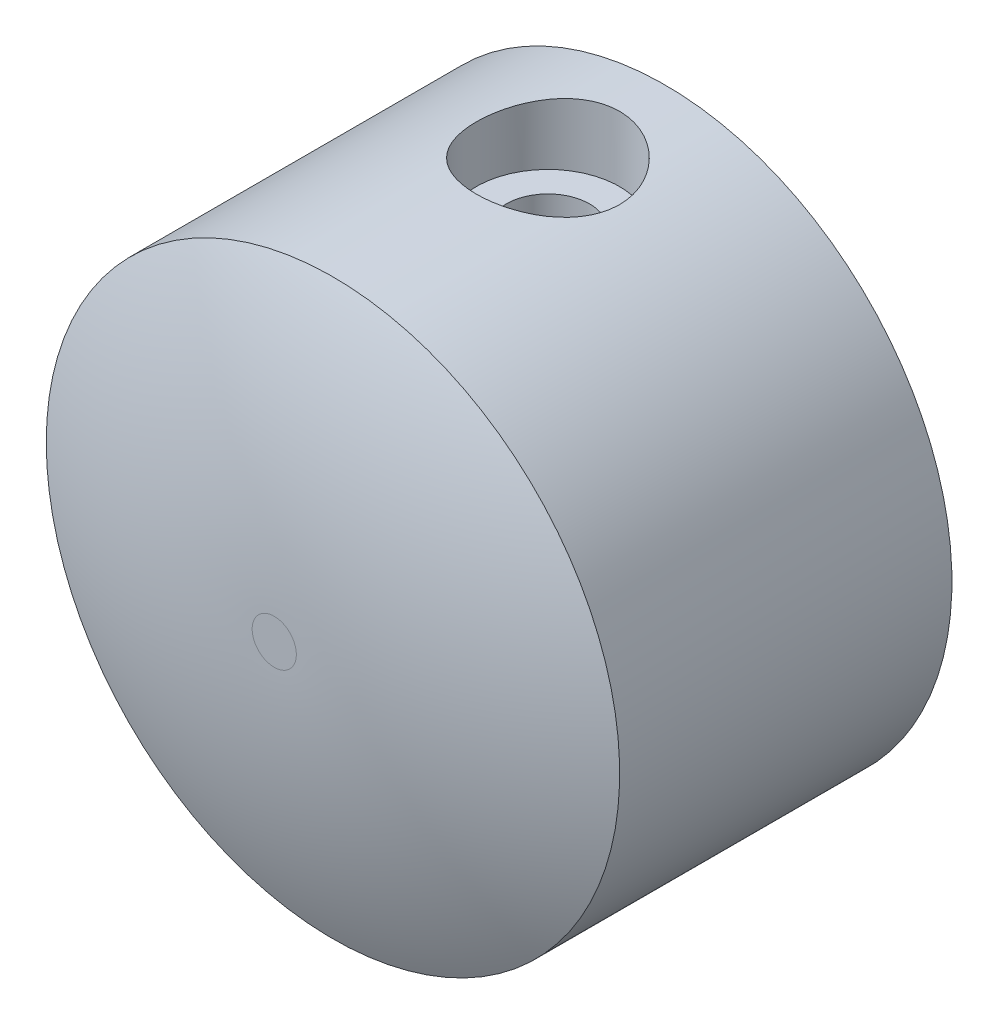
ISO-10303-21;
HEADER;
FILE_DESCRIPTION(('STEP AP214'),'2;1');
FILE_NAME('part.step','',(''),(''),'','','');
FILE_SCHEMA(('AUTOMOTIVE_DESIGN { 1 0 10303 214 1 1 1 1 }'));
ENDSEC;
DATA;
#1=APPLICATION_CONTEXT('core data for automotive mechanical design processes');
#2=APPLICATION_PROTOCOL_DEFINITION('international standard','automotive_design',2000,#1);
#3=PRODUCT_CONTEXT('',#1,'mechanical');
#4=PRODUCT('Part','Part','',(#3));
#5=PRODUCT_RELATED_PRODUCT_CATEGORY('part','',(#4));
#6=PRODUCT_DEFINITION_FORMATION('','',#4);
#7=PRODUCT_DEFINITION_CONTEXT('part definition',#1,'design');
#8=PRODUCT_DEFINITION('design','',#6,#7);
#9=PRODUCT_DEFINITION_SHAPE('','',#8);
#10=(LENGTH_UNIT() NAMED_UNIT(*) SI_UNIT(.MILLI.,.METRE.));
#11=(NAMED_UNIT(*) PLANE_ANGLE_UNIT() SI_UNIT($,.RADIAN.));
#12=(NAMED_UNIT(*) SI_UNIT($,.STERADIAN.) SOLID_ANGLE_UNIT());
#13=UNCERTAINTY_MEASURE_WITH_UNIT(LENGTH_MEASURE(1.E-05),#10,'distance_accuracy_value','');
#14=(GEOMETRIC_REPRESENTATION_CONTEXT(3) GLOBAL_UNCERTAINTY_ASSIGNED_CONTEXT((#13)) GLOBAL_UNIT_ASSIGNED_CONTEXT((#10,
#11,#12)) REPRESENTATION_CONTEXT('',''));
#15=CARTESIAN_POINT('',(0.,0.,0.));
#16=DIRECTION('',(0.,0.,1.));
#17=DIRECTION('',(1.,0.,0.));
#18=AXIS2_PLACEMENT_3D('',#15,#16,#17);
#19=CARTESIAN_POINT('',(0.,0.,0.));
#20=DIRECTION('',(0.,0.,-1.));
#21=DIRECTION('',(-1.,0.,0.));
#22=AXIS2_PLACEMENT_3D('',#19,#20,#21);
#23=CYLINDRICAL_SURFACE('',#22,11.);
#24=CARTESIAN_POINT('',(0.,0.,2.74688758676846));
#25=DIRECTION('',(0.,0.,-1.));
#26=DIRECTION('',(-1.,0.,0.));
#27=AXIS2_PLACEMENT_3D('',#24,#25,#26);
#28=CIRCLE('',#27,11.);
#29=CARTESIAN_POINT('',(-11.,0.,2.74688758676847));
#30=VERTEX_POINT('',#29);
#31=EDGE_CURVE('E250',#30,#30,#28,.T.);
#32=ORIENTED_EDGE('',*,*,#31,.T.);
#33=EDGE_LOOP('',(#32));
#34=FACE_BOUND('',#33,.T.);
#35=CARTESIAN_POINT('',(0.,0.,-10.));
#36=DIRECTION('',(0.,0.,-1.));
#37=DIRECTION('',(-1.,0.,0.));
#38=AXIS2_PLACEMENT_3D('',#35,#36,#37);
#39=CIRCLE('',#38,11.);
#40=CARTESIAN_POINT('',(-11.,0.,-10.));
#41=VERTEX_POINT('',#40);
#42=EDGE_CURVE('E247',#41,#41,#39,.T.);
#43=ORIENTED_EDGE('',*,*,#42,.F.);
#44=EDGE_LOOP('',(#43));
#45=FACE_BOUND('',#44,.T.);
#46=CARTESIAN_POINT('',(0.,11.,-2.75));
#47=CARTESIAN_POINT('',(-0.151939495894507,10.9999974309136,-2.75000426385329));
#48=CARTESIAN_POINT('',(-0.303926622689732,10.9968205990835,-2.76263450975194));
#49=CARTESIAN_POINT('',(-0.603544926912643,10.9844554202147,-2.81274611072951));
#50=CARTESIAN_POINT('',(-0.751173585929689,10.9752636660329,-2.85024155081939));
#51=CARTESIAN_POINT('',(-1.03770493233472,10.9518864827539,-2.94880529801382));
#52=CARTESIAN_POINT('',(-1.17661786628834,10.9377070521044,-3.00984529764466));
#53=CARTESIAN_POINT('',(-1.44223224182478,10.9058646364731,-3.15366588174888));
#54=CARTESIAN_POINT('',(-1.56893327130607,10.8882015339929,-3.23644719955144));
#55=CARTESIAN_POINT('',(-1.80913686671835,10.8509025825144,-3.42320144769933));
#56=CARTESIAN_POINT('',(-1.92235209844527,10.8312362977156,-3.52753788742494));
#57=CARTESIAN_POINT('',(-2.12987303320609,10.7923497021622,-3.75366237566656));
#58=CARTESIAN_POINT('',(-2.22417660107352,10.7731294419809,-3.87545239206938));
#59=CARTESIAN_POINT('',(-2.39254866179812,10.7370042211331,-4.13525791568448));
#60=CARTESIAN_POINT('',(-2.46629572919609,10.7201378985215,-4.273487589816));
#61=CARTESIAN_POINT('',(-2.58939433234303,10.6910740716636,-4.5608720880434));
#62=CARTESIAN_POINT('',(-2.63874976830692,10.6788758210643,-4.71002516110869));
#63=CARTESIAN_POINT('',(-2.7106838674754,10.6608420727659,-5.01186308003637));
#64=CARTESIAN_POINT('',(-2.73377915860876,10.6548840016119,-5.16441730940299));
#65=CARTESIAN_POINT('',(-2.75414658762175,10.6496383117592,-5.4713423764988));
#66=CARTESIAN_POINT('',(-2.75142292666654,10.6503496078454,-5.62571291460225));
#67=CARTESIAN_POINT('',(-2.72064196183946,10.6582521011416,-5.92792898086648));
#68=CARTESIAN_POINT('',(-2.69320029034949,10.6652858218004,-6.07584197268644));
#69=CARTESIAN_POINT('',(-2.61474434265549,10.6847896773029,-6.36489526000361));
#70=CARTESIAN_POINT('',(-2.56372838712722,10.697260199436,-6.50603507221969));
#71=CARTESIAN_POINT('',(-2.43904737621817,10.7263770882704,-6.7791863631289));
#72=CARTESIAN_POINT('',(-2.36515888992702,10.7430643369466,-6.91109131494754));
#73=CARTESIAN_POINT('',(-2.1969865060274,10.7787113655098,-7.1608509678875));
#74=CARTESIAN_POINT('',(-2.10269903948287,10.7976715428015,-7.27870320478996));
#75=CARTESIAN_POINT('',(-1.89321627858224,10.8363911432313,-7.50053996210641));
#76=CARTESIAN_POINT('',(-1.77750147330408,10.85615794043,-7.60403323177914));
#77=CARTESIAN_POINT('',(-1.53012184875678,10.8937760356105,-7.79023894451715));
#78=CARTESIAN_POINT('',(-1.39845654246456,10.9116272750725,-7.87295075281653));
#79=CARTESIAN_POINT('',(-1.12221246258255,10.9434917550602,-8.01542607474471));
#80=CARTESIAN_POINT('',(-0.977590887549143,10.9574916023417,-8.07510979046645));
#81=CARTESIAN_POINT('',(-0.679939348261952,10.979978478176,-8.16918172713422));
#82=CARTESIAN_POINT('',(-0.526910998442555,10.9884665612201,-8.20357478676659));
#83=CARTESIAN_POINT('',(-0.220989945715049,10.9988174866419,-8.2453388701912));
#84=CARTESIAN_POINT('',(-0.068193986645052,11.0008443143184,-8.25337888113805));
#85=CARTESIAN_POINT('',(0.236560270469432,10.9985114215983,-8.24404349623161));
#86=CARTESIAN_POINT('',(0.38851864268176,10.9941522761006,-8.22667038820158));
#87=CARTESIAN_POINT('',(0.684959492756899,10.9796423206681,-8.16755333461581));
#88=CARTESIAN_POINT('',(0.829519384776042,10.9695782934061,-8.12617435029222));
#89=CARTESIAN_POINT('',(1.10963836949628,10.9447929549596,-8.02063701261449));
#90=CARTESIAN_POINT('',(1.24519655155986,10.9300711734496,-7.95647635875909));
#91=CARTESIAN_POINT('',(1.50612574645469,10.8972106453141,-7.80590043039643));
#92=CARTESIAN_POINT('',(1.63127331003224,10.879015901721,-7.7191104606063));
#93=CARTESIAN_POINT('',(1.86546545834607,10.8413160017755,-7.52621850053853));
#94=CARTESIAN_POINT('',(1.97450725811762,10.8218106196374,-7.42011317736765));
#95=CARTESIAN_POINT('',(2.17614937479955,10.7830975442575,-7.18849640511987));
#96=CARTESIAN_POINT('',(2.26828042397202,10.7639089100121,-7.06257254450081));
#97=CARTESIAN_POINT('',(2.43010305819165,10.7285361036708,-6.7966568368076));
#98=CARTESIAN_POINT('',(2.49979563929591,10.7123517982244,-6.65666561455419));
#99=CARTESIAN_POINT('',(2.61424427111346,10.6849984031413,-6.3673395089219));
#100=CARTESIAN_POINT('',(2.65914806051324,10.6737996791339,-6.21806601476079));
#101=CARTESIAN_POINT('',(2.72313370989538,10.6576569737724,-5.91376566393196));
#102=CARTESIAN_POINT('',(2.74222121703917,10.6527116245445,-5.75874007312734));
#103=CARTESIAN_POINT('',(2.75373741561691,10.6497398557177,-5.45211145625372));
#104=CARTESIAN_POINT('',(2.74691614593145,10.6515187667684,-5.30053803560151));
#105=CARTESIAN_POINT('',(2.70852501023903,10.6613449983936,-5.00077620411185));
#106=CARTESIAN_POINT('',(2.67695564159208,10.669392192995,-4.85258772530915));
#107=CARTESIAN_POINT('',(2.59037408564545,10.6907397792054,-4.56461782504592));
#108=CARTESIAN_POINT('',(2.53550257524744,10.7040086126716,-4.42479160705939));
#109=CARTESIAN_POINT('',(2.40398567494254,10.7343088549492,-4.15623013169179));
#110=CARTESIAN_POINT('',(2.32733726506265,10.7513407855459,-4.02749641582405));
#111=CARTESIAN_POINT('',(2.15209087250144,10.7878032948327,-3.78114984682957));
#112=CARTESIAN_POINT('',(2.05297246533914,10.8072848552493,-3.66391469872273));
#113=CARTESIAN_POINT('',(1.83661384718117,10.8461471661815,-3.44749708454177));
#114=CARTESIAN_POINT('',(1.71936933897876,10.8655278916626,-3.34831891145956));
#115=CARTESIAN_POINT('',(1.46752390895475,10.9024236868739,-3.16907926763155));
#116=CARTESIAN_POINT('',(1.33264710758004,10.9198986117076,-3.0893965416021));
#117=CARTESIAN_POINT('',(1.0509877757692,10.9505902912105,-2.95396298460903));
#118=CARTESIAN_POINT('',(0.904213866300687,10.9638100953293,-2.89819500547768));
#119=CARTESIAN_POINT('',(0.631418797613031,10.9825477587016,-2.82045164439564));
#120=CARTESIAN_POINT('',(0.506696979998125,10.9890473926327,-2.79408938773537));
#121=CARTESIAN_POINT('',(0.254661131149852,10.9977744292524,-2.75886243669311));
#122=CARTESIAN_POINT('',(0.127347295611463,11.0000021532664,-2.74999642627361));
#123=CARTESIAN_POINT('',(0.,11.,-2.75));
#124=B_SPLINE_CURVE_WITH_KNOTS('',3,(#46,#47,#48,#49,#50,#51,#52,#53,#54,#55,#56,#57,#58,#59,
#60,#61,#62,#63,#64,#65,#66,#67,#68,#69,#70,#71,#72,#73,#74,#75,#76,#77,#78,#79,#80,#81,#82,#83,
#84,#85,#86,#87,#88,#89,#90,#91,#92,#93,#94,#95,#96,#97,#98,#99,#100,#101,#102,#103,#104,#105,
#106,#107,#108,#109,#110,#111,#112,#113,#114,#115,#116,#117,#118,#119,#120,#121,#122,#123),
.UNSPECIFIED.,.T.,.F.,(4,2,2,2,2,2,2,2,2,2,2,2,2,2,2,2,2,2,2,2,2,2,2,2,2,2,2,2,2,2,2,2,2,2,2,2,
2,2,4),(0.,0.455351806198464,0.910961769233816,1.36602565419119,1.82110489031043,
2.28459798301422,2.74814337563447,3.21857520500646,3.68893178810509,4.14986541018628,
4.61072403212699,5.06041244518954,5.51013289693825,5.964393011082,6.41873266539053,
6.88602751782623,7.35333664196208,7.82225086522797,8.29107535101933,8.74790233079761,
9.20468818712783,9.65470503281823,10.1047673343029,10.5628157720923,11.0209433218746,
11.4903160021429,11.9596678438019,12.426191334674,12.8926127597352,13.3456359740823,
13.7986500843017,14.2489673436976,14.6993470826176,15.1614755676228,15.6237137792321,
16.0943234009335,16.5645950034992,16.9462744540472,17.3279251942302),.UNSPECIFIED.);
#125=CARTESIAN_POINT('',(0.,11.,-2.75));
#126=VERTEX_POINT('',#125);
#127=EDGE_CURVE('E125',#126,#126,#124,.T.);
#128=ORIENTED_EDGE('',*,*,#127,.T.);
#129=EDGE_LOOP('',(#128));
#130=FACE_BOUND('',#129,.T.);
#131=CARTESIAN_POINT('',(0.,0.,-2.65));
#132=DIRECTION('',(0.,0.,-1.));
#133=DIRECTION('',(-1.,0.,0.));
#134=AXIS2_PLACEMENT_3D('',#131,#132,#133);
#135=CIRCLE('',#134,11.);
#136=CARTESIAN_POINT('',(1.64544826719043,-10.8762355619948,-2.65));
#137=VERTEX_POINT('',#136);
#138=CARTESIAN_POINT('',(-1.64544826719043,-10.8762355619948,-2.65));
#139=VERTEX_POINT('',#138);
#140=EDGE_CURVE('E11',#137,#139,#135,.T.);
#141=ORIENTED_EDGE('',*,*,#140,.F.);
#142=CARTESIAN_POINT('',(0.,0.,0.199999999999999));
#143=DIRECTION('',(-0.866025403784439,0.,-0.5));
#144=DIRECTION('',(0.5,0.,-0.866025403784439));
#145=AXIS2_PLACEMENT_3D('',#142,#143,#144);
#146=ELLIPSE('',#145,22.,11.);
#147=CARTESIAN_POINT('',(3.29089653438087,-10.4961897848696,-5.5));
#148=VERTEX_POINT('',#147);
#149=EDGE_CURVE('E43',#148,#137,#146,.T.);
#150=ORIENTED_EDGE('',*,*,#149,.F.);
#151=CARTESIAN_POINT('',(0.,0.,-11.2));
#152=DIRECTION('',(-0.866025403784439,0.,0.5));
#153=DIRECTION('',(-0.5,0.,-0.866025403784439));
#154=AXIS2_PLACEMENT_3D('',#151,#152,#153);
#155=ELLIPSE('',#154,22.,11.);
#156=CARTESIAN_POINT('',(1.64544826719043,-10.8762355619948,-8.35));
#157=VERTEX_POINT('',#156);
#158=EDGE_CURVE('E171',#157,#148,#155,.T.);
#159=ORIENTED_EDGE('',*,*,#158,.F.);
#160=CARTESIAN_POINT('',(0.,0.,-8.35));
#161=DIRECTION('',(0.,0.,1.));
#162=DIRECTION('',(1.,0.,0.));
#163=AXIS2_PLACEMENT_3D('',#160,#161,#162);
#164=CIRCLE('',#163,11.);
#165=CARTESIAN_POINT('',(-1.64544826719043,-10.8762355619948,-8.35));
#166=VERTEX_POINT('',#165);
#167=EDGE_CURVE('E169',#166,#157,#164,.T.);
#168=ORIENTED_EDGE('',*,*,#167,.F.);
#169=CARTESIAN_POINT('',(0.,0.,-11.2));
#170=DIRECTION('',(0.866025403784439,0.,0.5));
#171=DIRECTION('',(0.5,0.,-0.866025403784439));
#172=AXIS2_PLACEMENT_3D('',#169,#170,#171);
#173=ELLIPSE('',#172,22.,11.);
#174=CARTESIAN_POINT('',(-3.29089653438087,-10.4961897848696,-5.5));
#175=VERTEX_POINT('',#174);
#176=EDGE_CURVE('E166',#175,#166,#173,.T.);
#177=ORIENTED_EDGE('',*,*,#176,.F.);
#178=CARTESIAN_POINT('',(0.,0.,0.200000000000003));
#179=DIRECTION('',(0.866025403784439,0.,-0.5));
#180=DIRECTION('',(-0.5,0.,-0.866025403784439));
#181=AXIS2_PLACEMENT_3D('',#178,#179,#180);
#182=ELLIPSE('',#181,22.,11.);
#183=EDGE_CURVE('E164',#139,#175,#182,.T.);
#184=ORIENTED_EDGE('',*,*,#183,.F.);
#185=EDGE_LOOP('',(#141,#150,#159,#168,#177,#184));
#186=FACE_BOUND('',#185,.T.);
#187=ADVANCED_FACE('F35',(#34,#45,#130,#186),#23,.T.);
#188=CARTESIAN_POINT('',(0.,-11.,-5.5));
#189=DIRECTION('',(0.,1.,0.));
#190=DIRECTION('',(0.,0.,1.));
#191=AXIS2_PLACEMENT_3D('',#188,#189,#190);
#192=CYLINDRICAL_SURFACE('',#191,1.6);
#193=CARTESIAN_POINT('',(0.,6.,-3.9));
#194=CARTESIAN_POINT('',(0.0882036446662834,5.9999986704813,-3.90000209354788));
#195=CARTESIAN_POINT('',(0.176429728177472,5.99803588929723,-3.90731809135174));
#196=CARTESIAN_POINT('',(0.350340361083571,5.99039658897325,-3.93633698459095));
#197=CARTESIAN_POINT('',(0.436023666655269,5.98471828266059,-3.95804680354089));
#198=CARTESIAN_POINT('',(0.60231327123625,5.97027466602242,-4.01509733349123));
#199=CARTESIAN_POINT('',(0.682925960812229,5.96151333704337,-4.05042047013283));
#200=CARTESIAN_POINT('',(0.837082949114126,5.94182959321305,-4.13362979413328));
#201=CARTESIAN_POINT('',(0.910626776359695,5.93090703436005,-4.18151681868739));
#202=CARTESIAN_POINT('',(1.05026360299202,5.90779691921738,-4.28966681313074));
#203=CARTESIAN_POINT('',(1.11616935189025,5.8955877414348,-4.35016693440678));
#204=CARTESIAN_POINT('',(1.23702970928508,5.87141927743138,-4.48131878645052));
#205=CARTESIAN_POINT('',(1.29198290796523,5.85946002355797,-4.55197182209339));
#206=CARTESIAN_POINT('',(1.39029127394741,5.83692429973529,-4.702918587861));
#207=CARTESIAN_POINT('',(1.43343102189222,5.82637510858234,-4.78335706261178));
#208=CARTESIAN_POINT('',(1.50550038461563,5.80817181846908,-4.95067208887154));
#209=CARTESIAN_POINT('',(1.53443261960976,5.8005171857408,-5.03754744985618));
#210=CARTESIAN_POINT('',(1.5766153618114,5.78919292669855,-5.21319643026132));
#211=CARTESIAN_POINT('',(1.59020536195949,5.78543718352245,-5.30188283196172));
#212=CARTESIAN_POINT('',(1.60237627764874,5.78207864835752,-5.48035014666633));
#213=CARTESIAN_POINT('',(1.60095999764589,5.78247508038722,-5.57013085202849));
#214=CARTESIAN_POINT('',(1.58342808002097,5.78729903015237,-5.7455883322979));
#215=CARTESIAN_POINT('',(1.56772324851795,5.79161388402151,-5.83130974563043));
#216=CARTESIAN_POINT('',(1.52271798977763,5.80360810471624,-5.99885466756536));
#217=CARTESIAN_POINT('',(1.493416475944,5.81128774043995,-6.08067786406037));
#218=CARTESIAN_POINT('',(1.421714855722,5.82924529396782,-6.23917451504676));
#219=CARTESIAN_POINT('',(1.37917072910226,5.83955154254445,-6.31577947142898));
#220=CARTESIAN_POINT('',(1.28229203059023,5.86158583714473,-6.46090732708125));
#221=CARTESIAN_POINT('',(1.22795513779402,5.8733141628429,-6.52942863132518));
#222=CARTESIAN_POINT('',(1.10693285810735,5.89734008503746,-6.65879119796383));
#223=CARTESIAN_POINT('',(1.03990250182639,5.90964377191026,-6.71930905465196));
#224=CARTESIAN_POINT('',(0.896494134565099,5.93309105021092,-6.82831102428023));
#225=CARTESIAN_POINT('',(0.820115755364073,5.94423459590854,-6.87679466296194));
#226=CARTESIAN_POINT('',(0.659678604397961,5.96417456318624,-6.96049432225972));
#227=CARTESIAN_POINT('',(0.575587922041431,5.97296058266845,-6.99565181635887));
#228=CARTESIAN_POINT('',(0.402401835512317,5.98712035520802,-7.0512377510507));
#229=CARTESIAN_POINT('',(0.313307529542659,5.99249485386999,-7.07166941017917));
#230=CARTESIAN_POINT('',(0.135403266516412,5.99911326846707,-7.09671590153426));
#231=CARTESIAN_POINT('',(0.0466593901131035,6.00047197976769,-7.10177043188069));
#232=CARTESIAN_POINT('',(-0.130408036720959,5.99923577353354,-7.09713346860245));
#233=CARTESIAN_POINT('',(-0.218731629649689,5.99664126464274,-7.08744349911539));
#234=CARTESIAN_POINT('',(-0.390881959921425,5.98786428396825,-7.05395324203201));
#235=CARTESIAN_POINT('',(-0.474759881622231,5.98174421237093,-7.03039820304177));
#236=CARTESIAN_POINT('',(-0.637365576940845,5.96661035915282,-6.97013124439366));
#237=CARTESIAN_POINT('',(-0.716092791372797,5.9575962639682,-6.93341789899964));
#238=CARTESIAN_POINT('',(-0.867870779734385,5.93740528447735,-6.8470608902555));
#239=CARTESIAN_POINT('',(-0.94078015076904,5.92618949284386,-6.79717802656153));
#240=CARTESIAN_POINT('',(-1.07734770831762,5.9028916189203,-6.68619869587388));
#241=CARTESIAN_POINT('',(-1.14100406303899,5.89080936580444,-6.62510001392018));
#242=CARTESIAN_POINT('',(-1.25911139583055,5.8667179669498,-6.4913715380033));
#243=CARTESIAN_POINT('',(-1.31325215399989,5.85472049149563,-6.41846515087989));
#244=CARTESIAN_POINT('',(-1.40853752947959,5.83253157740069,-6.26434824312428));
#245=CARTESIAN_POINT('',(-1.44968268897221,5.82234006342218,-6.18313806911701));
#246=CARTESIAN_POINT('',(-1.51749929269189,5.80503414721321,-6.01512375432943));
#247=CARTESIAN_POINT('',(-1.54425449804718,5.79790198738987,-5.9283553505015));
#248=CARTESIAN_POINT('',(-1.58272964096634,5.78751860185751,-5.75132854421294));
#249=CARTESIAN_POINT('',(-1.5944534208239,5.78426638438256,-5.66107103970634));
#250=CARTESIAN_POINT('',(-1.60231191722602,5.78209395637349,-5.48280416970196));
#251=CARTESIAN_POINT('',(-1.59894524494388,5.78303518188826,-5.39481814379578));
#252=CARTESIAN_POINT('',(-1.5778750080045,5.78881916870635,-5.22071718878957));
#253=CARTESIAN_POINT('',(-1.56017181228047,5.7936618296109,-5.1346022115989));
#254=CARTESIAN_POINT('',(-1.51122012559733,5.80662056856999,-4.96731539829676));
#255=CARTESIAN_POINT('',(-1.48007728860457,5.81471108015306,-4.88611052581443));
#256=CARTESIAN_POINT('',(-1.40521243649916,5.83325454509352,-4.73001693557252));
#257=CARTESIAN_POINT('',(-1.36148844819695,5.84370786897202,-4.65512921095956));
#258=CARTESIAN_POINT('',(-1.26119127415051,5.86618337152254,-4.51141571240275));
#259=CARTESIAN_POINT('',(-1.20427783814327,5.87824266481322,-4.44283317201904));
#260=CARTESIAN_POINT('',(-1.07986442808881,5.90236403026437,-4.31603003866613));
#261=CARTESIAN_POINT('',(-1.012361883487,5.91442610238761,-4.25781196906492));
#262=CARTESIAN_POINT('',(-0.866943984870946,5.93750249923166,-4.15216620988252));
#263=CARTESIAN_POINT('',(-0.788836769401423,5.94848889051638,-4.10499599148054));
#264=CARTESIAN_POINT('',(-0.625510912333512,5.9678704808232,-4.02453006725651));
#265=CARTESIAN_POINT('',(-0.540296875757038,5.97626734146876,-3.99122545946912));
#266=CARTESIAN_POINT('',(-0.379499763904793,5.98843802010774,-3.94377977166759));
#267=CARTESIAN_POINT('',(-0.304609613252029,5.99274216474082,-3.927400493126));
#268=CARTESIAN_POINT('',(-0.153151836253661,5.99852359229165,-3.90551023506635));
#269=CARTESIAN_POINT('',(-0.0765843763238884,6.00000115437815,-3.89999818223998));
#270=CARTESIAN_POINT('',(0.,6.,-3.9));
#271=B_SPLINE_CURVE_WITH_KNOTS('',3,(#193,#194,#195,#196,#197,#198,#199,#200,#201,#202,#203,
#204,#205,#206,#207,#208,#209,#210,#211,#212,#213,#214,#215,#216,#217,#218,#219,#220,#221,#222,
#223,#224,#225,#226,#227,#228,#229,#230,#231,#232,#233,#234,#235,#236,#237,#238,#239,#240,#241,
#242,#243,#244,#245,#246,#247,#248,#249,#250,#251,#252,#253,#254,#255,#256,#257,#258,#259,#260,
#261,#262,#263,#264,#265,#266,#267,#268,#269,#270),.UNSPECIFIED.,.T.,.F.,(4,2,2,2,2,2,2,2,2,2,2,
2,2,2,2,2,2,2,2,2,2,2,2,2,2,2,2,2,2,2,2,2,2,2,2,2,2,2,4),(0.,0.264330079159655,0.52878739500916,
0.792904442377546,1.0570390936694,1.32667918363973,1.59635395940119,1.87066066018583,
2.1449167530376,2.41297726598071,2.68098768318787,2.94152801632129,3.20208917445683,
3.4655893867253,3.72914150489435,4.00129007845189,4.27344937545409,4.54679047677764,
4.82007181747442,5.08546174014969,5.35082423135612,5.61162828509024,5.87246060615823,
6.13840228798971,6.40439654602441,6.67789197101562,6.95137598414617,7.2232503815319,
7.49505526923061,7.75794673914764,8.0208314440835,8.28168612350517,8.54258173690277,
8.81115471648986,9.07979299457834,9.35417801816593,9.62838660908019,9.85791855186544,
10.0874278236498),.UNSPECIFIED.);
#272=CARTESIAN_POINT('',(0.,6.,-3.9));
#273=VERTEX_POINT('',#272);
#274=EDGE_CURVE('E117',#273,#273,#271,.T.);
#275=ORIENTED_EDGE('',*,*,#274,.F.);
#276=EDGE_LOOP('',(#275));
#277=FACE_BOUND('',#276,.T.);
#278=CARTESIAN_POINT('',(0.,8.5,-5.5));
#279=DIRECTION('',(0.,1.,0.));
#280=DIRECTION('',(0.,0.,1.));
#281=AXIS2_PLACEMENT_3D('',#278,#279,#280);
#282=CIRCLE('',#281,1.6);
#283=CARTESIAN_POINT('',(0.,8.5,-3.9));
#284=VERTEX_POINT('',#283);
#285=EDGE_CURVE('E116',#284,#284,#282,.F.);
#286=ORIENTED_EDGE('',*,*,#285,.F.);
#287=EDGE_LOOP('',(#286));
#288=FACE_BOUND('',#287,.T.);
#289=ADVANCED_FACE('F141',(#277,#288),#192,.F.);
#290=CARTESIAN_POINT('',(0.,0.,0.));
#291=DIRECTION('',(0.,0.,1.));
#292=DIRECTION('',(1.,0.,0.));
#293=AXIS2_PLACEMENT_3D('',#290,#291,#292);
#294=PLANE('',#293);
#295=CARTESIAN_POINT('',(0.,0.,0.));
#296=DIRECTION('',(0.,0.,-1.));
#297=DIRECTION('',(-1.,0.,0.));
#298=AXIS2_PLACEMENT_3D('',#295,#296,#297);
#299=CIRCLE('',#298,6.);
#300=CARTESIAN_POINT('',(-6.,0.,0.));
#301=VERTEX_POINT('',#300);
#302=EDGE_CURVE('E167',#301,#301,#299,.T.);
#303=ORIENTED_EDGE('',*,*,#302,.T.);
#304=EDGE_LOOP('',(#303));
#305=FACE_BOUND('',#304,.T.);
#306=ADVANCED_FACE('F37',(#305),#294,.F.);
#307=CARTESIAN_POINT('',(0.,0.,0.));
#308=DIRECTION('',(0.,0.,-1.));
#309=DIRECTION('',(-1.,0.,0.));
#310=AXIS2_PLACEMENT_3D('',#307,#308,#309);
#311=CYLINDRICAL_SURFACE('',#310,6.);
#312=CARTESIAN_POINT('',(0.,-6.,-3.9));
#313=CARTESIAN_POINT('',(-0.0882036446662834,-5.9999986704813,-3.90000209354788));
#314=CARTESIAN_POINT('',(-0.176429728177473,-5.99803588929723,-3.90731809135174));
#315=CARTESIAN_POINT('',(-0.350340361083571,-5.99039658897325,-3.93633698459095));
#316=CARTESIAN_POINT('',(-0.436023666655269,-5.98471828266059,-3.95804680354089));
#317=CARTESIAN_POINT('',(-0.60231327123625,-5.97027466602242,-4.01509733349123));
#318=CARTESIAN_POINT('',(-0.682925960812229,-5.96151333704337,-4.05042047013283));
#319=CARTESIAN_POINT('',(-0.837082949114126,-5.94182959321305,-4.13362979413328));
#320=CARTESIAN_POINT('',(-0.910626776359695,-5.93090703436005,-4.18151681868739));
#321=CARTESIAN_POINT('',(-1.05026360299202,-5.90779691921738,-4.28966681313074));
#322=CARTESIAN_POINT('',(-1.11616935189025,-5.8955877414348,-4.35016693440678));
#323=CARTESIAN_POINT('',(-1.23702970928508,-5.87141927743138,-4.48131878645052));
#324=CARTESIAN_POINT('',(-1.29198290796523,-5.85946002355797,-4.55197182209339));
#325=CARTESIAN_POINT('',(-1.3902912739474,-5.83692429973529,-4.702918587861));
#326=CARTESIAN_POINT('',(-1.43343102189222,-5.82637510858234,-4.78335706261178));
#327=CARTESIAN_POINT('',(-1.50550038461563,-5.80817181846908,-4.95067208887154));
#328=CARTESIAN_POINT('',(-1.53443261960976,-5.8005171857408,-5.03754744985618));
#329=CARTESIAN_POINT('',(-1.5766153618114,-5.78919292669855,-5.21319643026132));
#330=CARTESIAN_POINT('',(-1.59020536195949,-5.78543718352245,-5.30188283196172));
#331=CARTESIAN_POINT('',(-1.60237627764874,-5.78207864835752,-5.48035014666633));
#332=CARTESIAN_POINT('',(-1.60095999764589,-5.78247508038722,-5.57013085202849));
#333=CARTESIAN_POINT('',(-1.58342808002097,-5.78729903015237,-5.7455883322979));
#334=CARTESIAN_POINT('',(-1.56772324851795,-5.79161388402151,-5.83130974563043));
#335=CARTESIAN_POINT('',(-1.52271798977763,-5.80360810471625,-5.99885466756536));
#336=CARTESIAN_POINT('',(-1.493416475944,-5.81128774043995,-6.08067786406037));
#337=CARTESIAN_POINT('',(-1.421714855722,-5.82924529396782,-6.23917451504676));
#338=CARTESIAN_POINT('',(-1.37917072910226,-5.83955154254445,-6.31577947142898));
#339=CARTESIAN_POINT('',(-1.28229203059023,-5.86158583714473,-6.46090732708125));
#340=CARTESIAN_POINT('',(-1.22795513779401,-5.8733141628429,-6.52942863132518));
#341=CARTESIAN_POINT('',(-1.10693285810735,-5.89734008503746,-6.65879119796383));
#342=CARTESIAN_POINT('',(-1.03990250182639,-5.90964377191026,-6.71930905465196));
#343=CARTESIAN_POINT('',(-0.896494134565099,-5.93309105021092,-6.82831102428023));
#344=CARTESIAN_POINT('',(-0.820115755364072,-5.94423459590854,-6.87679466296194));
#345=CARTESIAN_POINT('',(-0.659678604397961,-5.96417456318624,-6.96049432225972));
#346=CARTESIAN_POINT('',(-0.575587922041431,-5.97296058266845,-6.99565181635887));
#347=CARTESIAN_POINT('',(-0.402401835512317,-5.98712035520802,-7.0512377510507));
#348=CARTESIAN_POINT('',(-0.313307529542659,-5.99249485386999,-7.07166941017917));
#349=CARTESIAN_POINT('',(-0.135403266516412,-5.99911326846707,-7.09671590153426));
#350=CARTESIAN_POINT('',(-0.046659390113104,-6.00047197976769,-7.10177043188069));
#351=CARTESIAN_POINT('',(0.130408036720958,-5.99923577353354,-7.09713346860245));
#352=CARTESIAN_POINT('',(0.218731629649689,-5.99664126464274,-7.08744349911539));
#353=CARTESIAN_POINT('',(0.390881959921425,-5.98786428396825,-7.05395324203201));
#354=CARTESIAN_POINT('',(0.474759881622232,-5.98174421237093,-7.03039820304177));
#355=CARTESIAN_POINT('',(0.637365576940845,-5.96661035915282,-6.97013124439366));
#356=CARTESIAN_POINT('',(0.716092791372797,-5.9575962639682,-6.93341789899964));
#357=CARTESIAN_POINT('',(0.867870779734385,-5.93740528447734,-6.8470608902555));
#358=CARTESIAN_POINT('',(0.94078015076904,-5.92618949284386,-6.79717802656153));
#359=CARTESIAN_POINT('',(1.07734770831762,-5.9028916189203,-6.68619869587388));
#360=CARTESIAN_POINT('',(1.14100406303899,-5.89080936580444,-6.62510001392018));
#361=CARTESIAN_POINT('',(1.25911139583055,-5.8667179669498,-6.4913715380033));
#362=CARTESIAN_POINT('',(1.31325215399989,-5.85472049149563,-6.41846515087989));
#363=CARTESIAN_POINT('',(1.40853752947959,-5.83253157740069,-6.26434824312428));
#364=CARTESIAN_POINT('',(1.44968268897221,-5.82234006342218,-6.18313806911701));
#365=CARTESIAN_POINT('',(1.51749929269189,-5.80503414721321,-6.01512375432943));
#366=CARTESIAN_POINT('',(1.54425449804718,-5.79790198738987,-5.9283553505015));
#367=CARTESIAN_POINT('',(1.58272964096634,-5.78751860185751,-5.75132854421294));
#368=CARTESIAN_POINT('',(1.5944534208239,-5.78426638438256,-5.66107103970634));
#369=CARTESIAN_POINT('',(1.60231191722602,-5.78209395637348,-5.48280416970196));
#370=CARTESIAN_POINT('',(1.59894524494388,-5.78303518188826,-5.39481814379578));
#371=CARTESIAN_POINT('',(1.5778750080045,-5.78881916870635,-5.22071718878957));
#372=CARTESIAN_POINT('',(1.56017181228047,-5.7936618296109,-5.13460221159889));
#373=CARTESIAN_POINT('',(1.51122012559733,-5.80662056856999,-4.96731539829676));
#374=CARTESIAN_POINT('',(1.48007728860457,-5.81471108015306,-4.88611052581442));
#375=CARTESIAN_POINT('',(1.40521243649916,-5.83325454509352,-4.73001693557252));
#376=CARTESIAN_POINT('',(1.36148844819695,-5.84370786897202,-4.65512921095956));
#377=CARTESIAN_POINT('',(1.26119127415051,-5.86618337152254,-4.51141571240275));
#378=CARTESIAN_POINT('',(1.20427783814327,-5.87824266481322,-4.44283317201904));
#379=CARTESIAN_POINT('',(1.0798644280888,-5.90236403026437,-4.31603003866613));
#380=CARTESIAN_POINT('',(1.012361883487,-5.91442610238761,-4.25781196906492));
#381=CARTESIAN_POINT('',(0.866943984870946,-5.93750249923166,-4.15216620988252));
#382=CARTESIAN_POINT('',(0.788836769401422,-5.94848889051638,-4.10499599148054));
#383=CARTESIAN_POINT('',(0.625510912333511,-5.9678704808232,-4.02453006725651));
#384=CARTESIAN_POINT('',(0.540296875757037,-5.97626734146876,-3.99122545946912));
#385=CARTESIAN_POINT('',(0.379499763904793,-5.98843802010774,-3.94377977166759));
#386=CARTESIAN_POINT('',(0.304609613252029,-5.99274216474082,-3.927400493126));
#387=CARTESIAN_POINT('',(0.153151836253661,-5.99852359229165,-3.90551023506635));
#388=CARTESIAN_POINT('',(0.0765843763238883,-6.00000115437815,-3.89999818223998));
#389=CARTESIAN_POINT('',(0.,-6.,-3.9));
#390=B_SPLINE_CURVE_WITH_KNOTS('',3,(#312,#313,#314,#315,#316,#317,#318,#319,#320,#321,#322,
#323,#324,#325,#326,#327,#328,#329,#330,#331,#332,#333,#334,#335,#336,#337,#338,#339,#340,#341,
#342,#343,#344,#345,#346,#347,#348,#349,#350,#351,#352,#353,#354,#355,#356,#357,#358,#359,#360,
#361,#362,#363,#364,#365,#366,#367,#368,#369,#370,#371,#372,#373,#374,#375,#376,#377,#378,#379,
#380,#381,#382,#383,#384,#385,#386,#387,#388,#389),.UNSPECIFIED.,.T.,.F.,(4,2,2,2,2,2,2,2,2,2,2,
2,2,2,2,2,2,2,2,2,2,2,2,2,2,2,2,2,2,2,2,2,2,2,2,2,2,2,4),(0.,0.264330079159655,0.52878739500916,
0.792904442377546,1.0570390936694,1.32667918363973,1.59635395940119,1.87066066018583,
2.1449167530376,2.41297726598071,2.68098768318787,2.94152801632129,3.20208917445683,
3.4655893867253,3.72914150489435,4.00129007845189,4.27344937545409,4.54679047677765,
4.82007181747443,5.08546174014969,5.35082423135612,5.61162828509024,5.87246060615823,
6.13840228798972,6.40439654602441,6.67789197101562,6.95137598414617,7.2232503815319,
7.49505526923061,7.75794673914764,8.0208314440835,8.28168612350517,8.54258173690277,
8.81115471648986,9.07979299457834,9.35417801816593,9.62838660908019,9.85791855186544,
10.0874278236498),.UNSPECIFIED.);
#391=CARTESIAN_POINT('',(0.,-6.,-3.9));
#392=VERTEX_POINT('',#391);
#393=EDGE_CURVE('E124',#392,#392,#390,.T.);
#394=ORIENTED_EDGE('',*,*,#393,.T.);
#395=EDGE_LOOP('',(#394));
#396=FACE_BOUND('',#395,.T.);
#397=ORIENTED_EDGE('',*,*,#274,.T.);
#398=EDGE_LOOP('',(#397));
#399=FACE_BOUND('',#398,.T.);
#400=ORIENTED_EDGE('',*,*,#302,.F.);
#401=EDGE_LOOP('',(#400));
#402=FACE_BOUND('',#401,.T.);
#403=CARTESIAN_POINT('',(0.,0.,-10.));
#404=DIRECTION('',(0.,0.,-1.));
#405=DIRECTION('',(-1.,0.,0.));
#406=AXIS2_PLACEMENT_3D('',#403,#404,#405);
#407=CIRCLE('',#406,6.);
#408=CARTESIAN_POINT('',(-6.,0.,-10.));
#409=VERTEX_POINT('',#408);
#410=EDGE_CURVE('E245',#409,#409,#407,.T.);
#411=ORIENTED_EDGE('',*,*,#410,.T.);
#412=EDGE_LOOP('',(#411));
#413=FACE_BOUND('',#412,.T.);
#414=ADVANCED_FACE('F130',(#396,#399,#402,#413),#311,.F.);
#415=CARTESIAN_POINT('',(6.,0.,-10.));
#416=DIRECTION('',(0.,0.,1.));
#417=DIRECTION('',(1.,0.,0.));
#418=AXIS2_PLACEMENT_3D('',#415,#416,#417);
#419=PLANE('',#418);
#420=ORIENTED_EDGE('',*,*,#410,.F.);
#421=EDGE_LOOP('',(#420));
#422=FACE_BOUND('',#421,.T.);
#423=ORIENTED_EDGE('',*,*,#42,.T.);
#424=EDGE_LOOP('',(#423));
#425=FACE_BOUND('',#424,.T.);
#426=ADVANCED_FACE('F151',(#422,#425),#419,.F.);
#427=CARTESIAN_POINT('',(0.,0.,-19.));
#428=DIRECTION('',(0.,0.,-1.));
#429=DIRECTION('',(-1.,0.,0.));
#430=AXIS2_PLACEMENT_3D('',#427,#428,#429);
#431=DEGENERATE_TOROIDAL_SURFACE('',#430,0.847518515729481,24.,.T.);
#432=ORIENTED_EDGE('',*,*,#31,.F.);
#433=EDGE_LOOP('',(#432));
#434=FACE_BOUND('',#433,.T.);
#435=CARTESIAN_POINT('',(0.,0.,5.));
#436=DIRECTION('',(0.,0.,-1.));
#437=DIRECTION('',(-1.,0.,0.));
#438=AXIS2_PLACEMENT_3D('',#435,#436,#437);
#439=CIRCLE('',#438,0.847518515729481);
#440=CARTESIAN_POINT('',(-0.84751851572948,0.,5.));
#441=VERTEX_POINT('',#440);
#442=EDGE_CURVE('E254',#441,#441,#439,.T.);
#443=ORIENTED_EDGE('',*,*,#442,.T.);
#444=EDGE_LOOP('',(#443));
#445=FACE_BOUND('',#444,.T.);
#446=ADVANCED_FACE('F147',(#434,#445),#431,.T.);
#447=CARTESIAN_POINT('',(0.,0.,5.));
#448=DIRECTION('',(0.,0.,-1.));
#449=DIRECTION('',(-1.,0.,0.));
#450=AXIS2_PLACEMENT_3D('',#447,#448,#449);
#451=PLANE('',#450);
#452=ORIENTED_EDGE('',*,*,#442,.F.);
#453=EDGE_LOOP('',(#452));
#454=FACE_BOUND('',#453,.T.);
#455=ADVANCED_FACE('F139',(#454),#451,.F.);
#456=CARTESIAN_POINT('',(0.,-8.5,-5.5));
#457=DIRECTION('',(0.,1.,0.));
#458=DIRECTION('',(0.,0.,1.));
#459=AXIS2_PLACEMENT_3D('',#456,#457,#458);
#460=CIRCLE('',#459,1.6);
#461=CARTESIAN_POINT('',(0.,-8.5,-3.9));
#462=VERTEX_POINT('',#461);
#463=EDGE_CURVE('E104',#462,#462,#460,.F.);
#464=ORIENTED_EDGE('',*,*,#463,.T.);
#465=EDGE_LOOP('',(#464));
#466=FACE_BOUND('',#465,.T.);
#467=ORIENTED_EDGE('',*,*,#393,.F.);
#468=EDGE_LOOP('',(#467));
#469=FACE_BOUND('',#468,.T.);
#470=ADVANCED_FACE('F133',(#466,#469),#192,.F.);
#471=CARTESIAN_POINT('',(0.,8.5,-5.5));
#472=DIRECTION('',(0.,1.,0.));
#473=DIRECTION('',(0.,0.,1.));
#474=AXIS2_PLACEMENT_3D('',#471,#472,#473);
#475=CYLINDRICAL_SURFACE('',#474,2.75);
#476=CARTESIAN_POINT('',(0.,8.5,-5.5));
#477=DIRECTION('',(0.,1.,0.));
#478=DIRECTION('',(0.,0.,1.));
#479=AXIS2_PLACEMENT_3D('',#476,#477,#478);
#480=CIRCLE('',#479,2.75);
#481=CARTESIAN_POINT('',(0.,8.5,-2.75));
#482=VERTEX_POINT('',#481);
#483=EDGE_CURVE('E108',#482,#482,#480,.T.);
#484=ORIENTED_EDGE('',*,*,#483,.F.);
#485=EDGE_LOOP('',(#484));
#486=FACE_BOUND('',#485,.T.);
#487=ORIENTED_EDGE('',*,*,#127,.F.);
#488=EDGE_LOOP('',(#487));
#489=FACE_BOUND('',#488,.T.);
#490=ADVANCED_FACE('F138',(#486,#489),#475,.F.);
#491=CARTESIAN_POINT('',(0.,8.5,-5.5));
#492=DIRECTION('',(0.,1.,0.));
#493=DIRECTION('',(0.,0.,1.));
#494=AXIS2_PLACEMENT_3D('',#491,#492,#493);
#495=PLANE('',#494);
#496=ORIENTED_EDGE('',*,*,#483,.T.);
#497=EDGE_LOOP('',(#496));
#498=FACE_BOUND('',#497,.T.);
#499=ORIENTED_EDGE('',*,*,#285,.T.);
#500=EDGE_LOOP('',(#499));
#501=FACE_BOUND('',#500,.T.);
#502=ADVANCED_FACE('F216',(#498,#501),#495,.T.);
#503=CARTESIAN_POINT('',(-1.64544826719043,-8.5,-2.65));
#504=DIRECTION('',(0.,0.,-1.));
#505=DIRECTION('',(-1.,0.,0.));
#506=AXIS2_PLACEMENT_3D('',#503,#504,#505);
#507=PLANE('',#506);
#508=ORIENTED_EDGE('',*,*,#140,.T.);
#509=DIRECTION('',(0.,-1.,0.));
#510=VECTOR('',#509,1.);
#511=CARTESIAN_POINT('',(-1.64544826719043,-8.5,-2.65));
#512=LINE('',#511,#510);
#513=CARTESIAN_POINT('',(-1.64544826719043,-8.5,-2.65));
#514=VERTEX_POINT('',#513);
#515=EDGE_CURVE('E50',#514,#139,#512,.T.);
#516=ORIENTED_EDGE('',*,*,#515,.F.);
#517=DIRECTION('',(1.,0.,0.));
#518=VECTOR('',#517,1.);
#519=CARTESIAN_POINT('',(-1.64544826719043,-8.5,-2.65));
#520=LINE('',#519,#518);
#521=CARTESIAN_POINT('',(1.64544826719043,-8.5,-2.65));
#522=VERTEX_POINT('',#521);
#523=EDGE_CURVE('E93',#514,#522,#520,.T.);
#524=ORIENTED_EDGE('',*,*,#523,.T.);
#525=DIRECTION('',(0.,-1.,0.));
#526=VECTOR('',#525,1.);
#527=CARTESIAN_POINT('',(1.64544826719043,-8.5,-2.65));
#528=LINE('',#527,#526);
#529=EDGE_CURVE('E100',#522,#137,#528,.T.);
#530=ORIENTED_EDGE('',*,*,#529,.T.);
#531=EDGE_LOOP('',(#508,#516,#524,#530));
#532=FACE_BOUND('',#531,.T.);
#533=ADVANCED_FACE('F99',(#532),#507,.T.);
#534=CARTESIAN_POINT('',(1.64544826719043,-8.5,-2.65));
#535=DIRECTION('',(-0.866025403784439,0.,-0.5));
#536=DIRECTION('',(-0.5,0.,0.866025403784439));
#537=AXIS2_PLACEMENT_3D('',#534,#535,#536);
#538=PLANE('',#537);
#539=ORIENTED_EDGE('',*,*,#149,.T.);
#540=ORIENTED_EDGE('',*,*,#529,.F.);
#541=DIRECTION('',(0.5,0.,-0.866025403784438));
#542=VECTOR('',#541,1.);
#543=CARTESIAN_POINT('',(1.64544826719043,-8.5,-2.65));
#544=LINE('',#543,#542);
#545=CARTESIAN_POINT('',(3.29089653438087,-8.5,-5.5));
#546=VERTEX_POINT('',#545);
#547=EDGE_CURVE('E88',#522,#546,#544,.T.);
#548=ORIENTED_EDGE('',*,*,#547,.T.);
#549=DIRECTION('',(0.,-1.,0.));
#550=VECTOR('',#549,1.);
#551=CARTESIAN_POINT('',(3.29089653438087,-8.5,-5.5));
#552=LINE('',#551,#550);
#553=EDGE_CURVE('E105',#546,#148,#552,.T.);
#554=ORIENTED_EDGE('',*,*,#553,.T.);
#555=EDGE_LOOP('',(#539,#540,#548,#554));
#556=FACE_BOUND('',#555,.T.);
#557=ADVANCED_FACE('F103',(#556),#538,.T.);
#558=CARTESIAN_POINT('',(3.29089653438087,-8.5,-5.5));
#559=DIRECTION('',(-0.866025403784439,0.,0.5));
#560=DIRECTION('',(0.5,0.,0.866025403784439));
#561=AXIS2_PLACEMENT_3D('',#558,#559,#560);
#562=PLANE('',#561);
#563=ORIENTED_EDGE('',*,*,#158,.T.);
#564=ORIENTED_EDGE('',*,*,#553,.F.);
#565=DIRECTION('',(-0.5,0.,-0.866025403784439));
#566=VECTOR('',#565,1.);
#567=CARTESIAN_POINT('',(3.29089653438087,-8.5,-5.5));
#568=LINE('',#567,#566);
#569=CARTESIAN_POINT('',(1.64544826719043,-8.5,-8.35));
#570=VERTEX_POINT('',#569);
#571=EDGE_CURVE('E95',#546,#570,#568,.T.);
#572=ORIENTED_EDGE('',*,*,#571,.T.);
#573=DIRECTION('',(0.,-1.,0.));
#574=VECTOR('',#573,1.);
#575=CARTESIAN_POINT('',(1.64544826719043,-8.5,-8.35));
#576=LINE('',#575,#574);
#577=EDGE_CURVE('E110',#570,#157,#576,.T.);
#578=ORIENTED_EDGE('',*,*,#577,.T.);
#579=EDGE_LOOP('',(#563,#564,#572,#578));
#580=FACE_BOUND('',#579,.T.);
#581=ADVANCED_FACE('F175',(#580),#562,.T.);
#582=CARTESIAN_POINT('',(1.64544826719043,-8.5,-8.35));
#583=DIRECTION('',(0.,0.,1.));
#584=DIRECTION('',(1.,0.,0.));
#585=AXIS2_PLACEMENT_3D('',#582,#583,#584);
#586=PLANE('',#585);
#587=ORIENTED_EDGE('',*,*,#167,.T.);
#588=ORIENTED_EDGE('',*,*,#577,.F.);
#589=DIRECTION('',(-1.,0.,0.));
#590=VECTOR('',#589,1.);
#591=CARTESIAN_POINT('',(1.64544826719043,-8.5,-8.35));
#592=LINE('',#591,#590);
#593=CARTESIAN_POINT('',(-1.64544826719043,-8.5,-8.35));
#594=VERTEX_POINT('',#593);
#595=EDGE_CURVE('E199',#570,#594,#592,.T.);
#596=ORIENTED_EDGE('',*,*,#595,.T.);
#597=DIRECTION('',(0.,-1.,0.));
#598=VECTOR('',#597,1.);
#599=CARTESIAN_POINT('',(-1.64544826719043,-8.5,-8.35));
#600=LINE('',#599,#598);
#601=EDGE_CURVE('E191',#594,#166,#600,.T.);
#602=ORIENTED_EDGE('',*,*,#601,.T.);
#603=EDGE_LOOP('',(#587,#588,#596,#602));
#604=FACE_BOUND('',#603,.T.);
#605=ADVANCED_FACE('F202',(#604),#586,.T.);
#606=CARTESIAN_POINT('',(-1.64544826719043,-8.5,-8.35));
#607=DIRECTION('',(0.866025403784439,0.,0.5));
#608=DIRECTION('',(0.5,0.,-0.866025403784439));
#609=AXIS2_PLACEMENT_3D('',#606,#607,#608);
#610=PLANE('',#609);
#611=ORIENTED_EDGE('',*,*,#176,.T.);
#612=ORIENTED_EDGE('',*,*,#601,.F.);
#613=DIRECTION('',(-0.5,0.,0.866025403784439));
#614=VECTOR('',#613,1.);
#615=CARTESIAN_POINT('',(-1.64544826719043,-8.5,-8.35));
#616=LINE('',#615,#614);
#617=CARTESIAN_POINT('',(-3.29089653438087,-8.5,-5.5));
#618=VERTEX_POINT('',#617);
#619=EDGE_CURVE('E190',#594,#618,#616,.T.);
#620=ORIENTED_EDGE('',*,*,#619,.T.);
#621=DIRECTION('',(0.,-1.,0.));
#622=VECTOR('',#621,1.);
#623=CARTESIAN_POINT('',(-3.29089653438087,-8.5,-5.5));
#624=LINE('',#623,#622);
#625=EDGE_CURVE('E184',#618,#175,#624,.T.);
#626=ORIENTED_EDGE('',*,*,#625,.T.);
#627=EDGE_LOOP('',(#611,#612,#620,#626));
#628=FACE_BOUND('',#627,.T.);
#629=ADVANCED_FACE('F186',(#628),#610,.T.);
#630=CARTESIAN_POINT('',(-3.29089653438087,-8.5,-5.5));
#631=DIRECTION('',(0.866025403784439,0.,-0.5));
#632=DIRECTION('',(-0.5,0.,-0.866025403784439));
#633=AXIS2_PLACEMENT_3D('',#630,#631,#632);
#634=PLANE('',#633);
#635=ORIENTED_EDGE('',*,*,#183,.T.);
#636=ORIENTED_EDGE('',*,*,#625,.F.);
#637=DIRECTION('',(0.5,0.,0.866025403784439));
#638=VECTOR('',#637,1.);
#639=CARTESIAN_POINT('',(-3.29089653438087,-8.5,-5.5));
#640=LINE('',#639,#638);
#641=EDGE_CURVE('E194',#618,#514,#640,.T.);
#642=ORIENTED_EDGE('',*,*,#641,.T.);
#643=ORIENTED_EDGE('',*,*,#515,.T.);
#644=EDGE_LOOP('',(#635,#636,#642,#643));
#645=FACE_BOUND('',#644,.T.);
#646=ADVANCED_FACE('F183',(#645),#634,.T.);
#647=CARTESIAN_POINT('',(0.,-8.5,0.));
#648=DIRECTION('',(0.,1.,0.));
#649=DIRECTION('',(0.,0.,1.));
#650=AXIS2_PLACEMENT_3D('',#647,#648,#649);
#651=PLANE('',#650);
#652=ORIENTED_EDGE('',*,*,#523,.F.);
#653=ORIENTED_EDGE('',*,*,#641,.F.);
#654=ORIENTED_EDGE('',*,*,#619,.F.);
#655=ORIENTED_EDGE('',*,*,#595,.F.);
#656=ORIENTED_EDGE('',*,*,#571,.F.);
#657=ORIENTED_EDGE('',*,*,#547,.F.);
#658=EDGE_LOOP('',(#652,#653,#654,#655,#656,#657));
#659=FACE_BOUND('',#658,.T.);
#660=ORIENTED_EDGE('',*,*,#463,.F.);
#661=EDGE_LOOP('',(#660));
#662=FACE_BOUND('',#661,.T.);
#663=ADVANCED_FACE('F90',(#659,#662),#651,.F.);
#664=CLOSED_SHELL('',(#187,#289,#306,#414,#426,#446,#455,#470,#490,#502,#533,#557,#581,#605,
#629,#646,#663));
#665=MANIFOLD_SOLID_BREP('B2',#664);
#666=ADVANCED_BREP_SHAPE_REPRESENTATION('',(#18,#665),#14);
#667=SHAPE_DEFINITION_REPRESENTATION(#9,#666);
ENDSEC;
END-ISO-10303-21;
